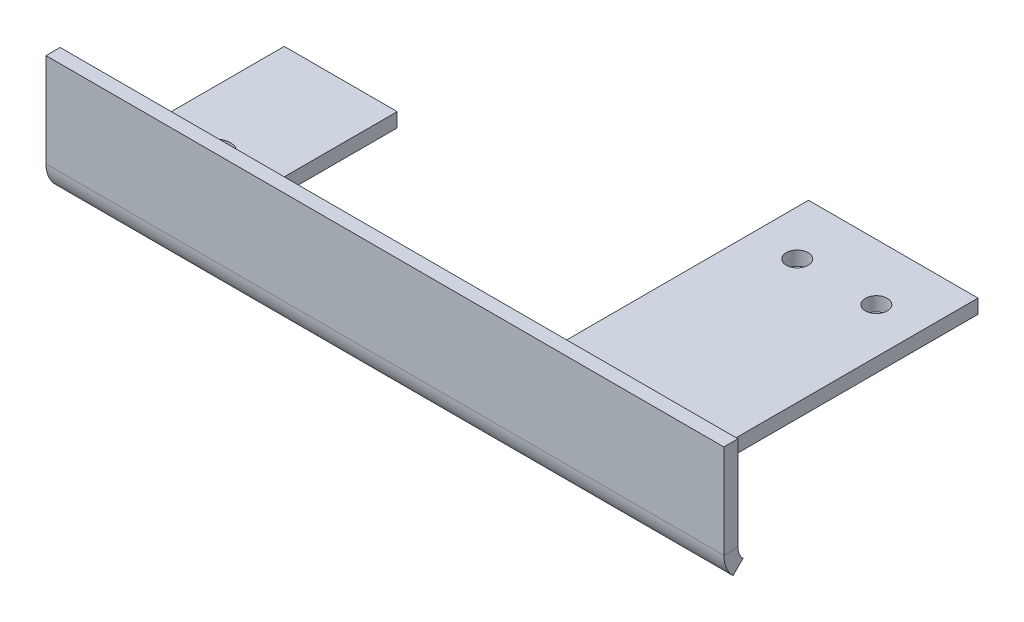
ISO-10303-21;
HEADER;
FILE_DESCRIPTION(('STEP AP214'),'2;1');
FILE_NAME('part.step','',(''),(''),'','','');
FILE_SCHEMA(('AUTOMOTIVE_DESIGN { 1 0 10303 214 1 1 1 1 }'));
ENDSEC;
DATA;
#1=APPLICATION_CONTEXT('core data for automotive mechanical design processes');
#2=APPLICATION_PROTOCOL_DEFINITION('international standard','automotive_design',2000,#1);
#3=PRODUCT_CONTEXT('',#1,'mechanical');
#4=PRODUCT('Part','Part','',(#3));
#5=PRODUCT_RELATED_PRODUCT_CATEGORY('part','',(#4));
#6=PRODUCT_DEFINITION_FORMATION('','',#4);
#7=PRODUCT_DEFINITION_CONTEXT('part definition',#1,'design');
#8=PRODUCT_DEFINITION('design','',#6,#7);
#9=PRODUCT_DEFINITION_SHAPE('','',#8);
#10=(LENGTH_UNIT() NAMED_UNIT(*) SI_UNIT(.MILLI.,.METRE.));
#11=(NAMED_UNIT(*) PLANE_ANGLE_UNIT() SI_UNIT($,.RADIAN.));
#12=(NAMED_UNIT(*) SI_UNIT($,.STERADIAN.) SOLID_ANGLE_UNIT());
#13=UNCERTAINTY_MEASURE_WITH_UNIT(LENGTH_MEASURE(1.E-05),#10,'distance_accuracy_value','');
#14=(GEOMETRIC_REPRESENTATION_CONTEXT(3) GLOBAL_UNCERTAINTY_ASSIGNED_CONTEXT((#13)) GLOBAL_UNIT_ASSIGNED_CONTEXT((#10,
#11,#12)) REPRESENTATION_CONTEXT('',''));
#15=CARTESIAN_POINT('',(0.,0.,0.));
#16=DIRECTION('',(0.,0.,1.));
#17=DIRECTION('',(1.,0.,0.));
#18=AXIS2_PLACEMENT_3D('',#15,#16,#17);
#19=CARTESIAN_POINT('',(127.,1.58750000000002,-5.53197197140583));
#20=DIRECTION('',(1.,0.,0.));
#21=DIRECTION('',(0.,0.,1.));
#22=AXIS2_PLACEMENT_3D('',#19,#20,#21);
#23=PLANE('',#22);
#24=DIRECTION('',(0.,0.,-1.));
#25=VECTOR('',#24,1.);
#26=CARTESIAN_POINT('',(127.,-1.58749999999998,-5.53197197140585));
#27=LINE('',#26,#25);
#28=CARTESIAN_POINT('',(127.,-1.58749999999942,-85.3133719714059));
#29=VERTEX_POINT('',#28);
#30=CARTESIAN_POINT('',(127.,-1.58749999999995,-9.84498598570294));
#31=VERTEX_POINT('',#30);
#32=EDGE_CURVE('E266',#29,#31,#27,.F.);
#33=ORIENTED_EDGE('',*,*,#32,.F.);
#34=DIRECTION('',(0.,1.,0.));
#35=VECTOR('',#34,1.);
#36=CARTESIAN_POINT('',(127.,1.58750000000058,-85.3133719714058));
#37=LINE('',#36,#35);
#38=CARTESIAN_POINT('',(127.,1.58750000000058,-85.3133719714058));
#39=VERTEX_POINT('',#38);
#40=EDGE_CURVE('E267',#29,#39,#37,.T.);
#41=ORIENTED_EDGE('',*,*,#40,.T.);
#42=DIRECTION('',(0.,0.,1.));
#43=VECTOR('',#42,1.);
#44=CARTESIAN_POINT('',(127.,1.58750000000002,-5.53197197140583));
#45=LINE('',#44,#43);
#46=CARTESIAN_POINT('',(127.,1.58750000000005,-9.84498598570292));
#47=VERTEX_POINT('',#46);
#48=EDGE_CURVE('E264',#39,#47,#45,.T.);
#49=ORIENTED_EDGE('',*,*,#48,.T.);
#50=DIRECTION('',(0.,1.,0.));
#51=VECTOR('',#50,1.);
#52=CARTESIAN_POINT('',(127.,1.58750000000005,-9.84498598570292));
#53=LINE('',#52,#51);
#54=EDGE_CURVE('E210',#31,#47,#53,.T.);
#55=ORIENTED_EDGE('',*,*,#54,.F.);
#56=EDGE_LOOP('',(#33,#41,#49,#55));
#57=FACE_BOUND('',#56,.T.);
#58=ADVANCED_FACE('F43',(#57),#23,.T.);
#59=CARTESIAN_POINT('',(88.9,1.58750000000002,-5.53197197140583));
#60=DIRECTION('',(-1.,0.,0.));
#61=DIRECTION('',(0.,0.,-1.));
#62=AXIS2_PLACEMENT_3D('',#59,#60,#61);
#63=PLANE('',#62);
#64=DIRECTION('',(0.,0.,-1.));
#65=VECTOR('',#64,1.);
#66=CARTESIAN_POINT('',(88.9,1.58750000000002,-5.53197197140583));
#67=LINE('',#66,#65);
#68=CARTESIAN_POINT('',(88.9,1.58750000000005,-9.84498598570292));
#69=VERTEX_POINT('',#68);
#70=CARTESIAN_POINT('',(88.9,1.58750000000058,-85.3133719714058));
#71=VERTEX_POINT('',#70);
#72=EDGE_CURVE('E47',#69,#71,#67,.T.);
#73=ORIENTED_EDGE('',*,*,#72,.T.);
#74=DIRECTION('',(0.,1.,0.));
#75=VECTOR('',#74,1.);
#76=CARTESIAN_POINT('',(88.9,1.58750000000058,-85.3133719714058));
#77=LINE('',#76,#75);
#78=CARTESIAN_POINT('',(88.9,-1.58749999999942,-85.3133719714059));
#79=VERTEX_POINT('',#78);
#80=EDGE_CURVE('E270',#79,#71,#77,.T.);
#81=ORIENTED_EDGE('',*,*,#80,.F.);
#82=DIRECTION('',(0.,0.,-1.));
#83=VECTOR('',#82,1.);
#84=CARTESIAN_POINT('',(88.9,-1.58749999999998,-5.53197197140585));
#85=LINE('',#84,#83);
#86=CARTESIAN_POINT('',(88.9,-1.58749999999995,-9.84498598570294));
#87=VERTEX_POINT('',#86);
#88=EDGE_CURVE('E236',#87,#79,#85,.T.);
#89=ORIENTED_EDGE('',*,*,#88,.F.);
#90=DIRECTION('',(0.,-1.,0.));
#91=VECTOR('',#90,1.);
#92=CARTESIAN_POINT('',(88.9,1.58750000000005,-9.84498598570292));
#93=LINE('',#92,#91);
#94=EDGE_CURVE('E11',#69,#87,#93,.T.);
#95=ORIENTED_EDGE('',*,*,#94,.F.);
#96=EDGE_LOOP('',(#73,#81,#89,#95));
#97=FACE_BOUND('',#96,.T.);
#98=ADVANCED_FACE('F288',(#97),#63,.T.);
#99=CARTESIAN_POINT('',(0.,1.58750000000002,-5.53197197140583));
#100=DIRECTION('',(0.,1.,0.));
#101=DIRECTION('',(0.,0.,-1.));
#102=AXIS2_PLACEMENT_3D('',#99,#100,#101);
#103=PLANE('',#102);
#104=CARTESIAN_POINT('',(116.84,1.58750000000049,-72.6133719714058));
#105=DIRECTION('',(0.,-1.,0.));
#106=DIRECTION('',(0.,0.,-1.));
#107=AXIS2_PLACEMENT_3D('',#104,#105,#106);
#108=CIRCLE('',#107,2.4638);
#109=CARTESIAN_POINT('',(116.84,1.5875000000005,-75.0771719714058));
#110=VERTEX_POINT('',#109);
#111=EDGE_CURVE('E319',#110,#110,#108,.T.);
#112=ORIENTED_EDGE('',*,*,#111,.T.);
#113=EDGE_LOOP('',(#112));
#114=FACE_BOUND('',#113,.T.);
#115=CARTESIAN_POINT('',(99.06,1.58750000000049,-72.6133719714058));
#116=DIRECTION('',(0.,-1.,0.));
#117=DIRECTION('',(0.,0.,-1.));
#118=AXIS2_PLACEMENT_3D('',#115,#116,#117);
#119=CIRCLE('',#118,2.4638);
#120=CARTESIAN_POINT('',(99.06,1.5875000000005,-75.0771719714058));
#121=VERTEX_POINT('',#120);
#122=EDGE_CURVE('E322',#121,#121,#119,.T.);
#123=ORIENTED_EDGE('',*,*,#122,.T.);
#124=EDGE_LOOP('',(#123));
#125=FACE_BOUND('',#124,.T.);
#126=ORIENTED_EDGE('',*,*,#48,.F.);
#127=DIRECTION('',(1.,0.,0.));
#128=VECTOR('',#127,1.);
#129=CARTESIAN_POINT('',(88.9,1.58750000000058,-85.3133719714058));
#130=LINE('',#129,#128);
#131=EDGE_CURVE('E68',#71,#39,#130,.T.);
#132=ORIENTED_EDGE('',*,*,#131,.F.);
#133=ORIENTED_EDGE('',*,*,#72,.F.);
#134=DIRECTION('',(-1.,0.,0.));
#135=VECTOR('',#134,1.);
#136=CARTESIAN_POINT('',(0.,1.58750000000005,-9.84498598570292));
#137=LINE('',#136,#135);
#138=EDGE_CURVE('E272',#47,#69,#137,.T.);
#139=ORIENTED_EDGE('',*,*,#138,.F.);
#140=EDGE_LOOP('',(#126,#132,#133,#139));
#141=FACE_BOUND('',#140,.T.);
#142=ADVANCED_FACE('F282',(#114,#125,#141),#103,.T.);
#143=CARTESIAN_POINT('',(88.9,1.58750000000058,-85.3133719714058));
#144=DIRECTION('',(0.,0.,-1.));
#145=DIRECTION('',(1.,0.,0.));
#146=AXIS2_PLACEMENT_3D('',#143,#144,#145);
#147=PLANE('',#146);
#148=ORIENTED_EDGE('',*,*,#80,.T.);
#149=ORIENTED_EDGE('',*,*,#131,.T.);
#150=ORIENTED_EDGE('',*,*,#40,.F.);
#151=DIRECTION('',(1.,0.,0.));
#152=VECTOR('',#151,1.);
#153=CARTESIAN_POINT('',(0.,-1.58749999999942,-85.3133719714059));
#154=LINE('',#153,#152);
#155=EDGE_CURVE('E78',#79,#29,#154,.T.);
#156=ORIENTED_EDGE('',*,*,#155,.F.);
#157=EDGE_LOOP('',(#148,#149,#150,#156));
#158=FACE_BOUND('',#157,.T.);
#159=ADVANCED_FACE('F309',(#158),#147,.T.);
#160=CARTESIAN_POINT('',(0.,-1.58749999999998,-5.53197197140585));
#161=DIRECTION('',(0.,1.,0.));
#162=DIRECTION('',(0.,0.,-1.));
#163=AXIS2_PLACEMENT_3D('',#160,#161,#162);
#164=PLANE('',#163);
#165=CARTESIAN_POINT('',(116.84,-1.58749999999951,-72.6133719714059));
#166=DIRECTION('',(0.,-1.,0.));
#167=DIRECTION('',(0.,0.,-1.));
#168=AXIS2_PLACEMENT_3D('',#165,#166,#167);
#169=CIRCLE('',#168,2.4638);
#170=CARTESIAN_POINT('',(116.84,-1.5874999999995,-75.0771719714059));
#171=VERTEX_POINT('',#170);
#172=EDGE_CURVE('E325',#171,#171,#169,.T.);
#173=ORIENTED_EDGE('',*,*,#172,.F.);
#174=EDGE_LOOP('',(#173));
#175=FACE_BOUND('',#174,.T.);
#176=CARTESIAN_POINT('',(99.06,-1.58749999999951,-72.6133719714059));
#177=DIRECTION('',(0.,-1.,0.));
#178=DIRECTION('',(0.,0.,-1.));
#179=AXIS2_PLACEMENT_3D('',#176,#177,#178);
#180=CIRCLE('',#179,2.4638);
#181=CARTESIAN_POINT('',(99.06,-1.5874999999995,-75.0771719714059));
#182=VERTEX_POINT('',#181);
#183=EDGE_CURVE('E324',#182,#182,#180,.T.);
#184=ORIENTED_EDGE('',*,*,#183,.F.);
#185=EDGE_LOOP('',(#184));
#186=FACE_BOUND('',#185,.T.);
#187=DIRECTION('',(-1.,0.,0.));
#188=VECTOR('',#187,1.);
#189=CARTESIAN_POINT('',(0.,-1.58749999999995,-9.84498598570295));
#190=LINE('',#189,#188);
#191=EDGE_CURVE('E52',#31,#87,#190,.T.);
#192=ORIENTED_EDGE('',*,*,#191,.T.);
#193=ORIENTED_EDGE('',*,*,#88,.T.);
#194=ORIENTED_EDGE('',*,*,#155,.T.);
#195=ORIENTED_EDGE('',*,*,#32,.T.);
#196=EDGE_LOOP('',(#192,#193,#194,#195));
#197=FACE_BOUND('',#196,.T.);
#198=ADVANCED_FACE('F45',(#175,#186,#197),#164,.F.);
#199=CARTESIAN_POINT('',(127.,26.5784859857029,-5.94098598570283));
#200=DIRECTION('',(0.,1.,0.));
#201=DIRECTION('',(-1.,0.,0.));
#202=AXIS2_PLACEMENT_3D('',#199,#200,#201);
#203=PLANE('',#202);
#204=DIRECTION('',(0.,0.,-1.));
#205=VECTOR('',#204,1.);
#206=CARTESIAN_POINT('',(152.4,26.5784859857029,-5.94098598570283));
#207=LINE('',#206,#205);
#208=CARTESIAN_POINT('',(152.4,26.5784859857029,-2.76598598570283));
#209=VERTEX_POINT('',#208);
#210=CARTESIAN_POINT('',(152.4,26.5784859857029,-5.94098598570283));
#211=VERTEX_POINT('',#210);
#212=EDGE_CURVE('E240',#209,#211,#207,.T.);
#213=ORIENTED_EDGE('',*,*,#212,.T.);
#214=DIRECTION('',(-1.,0.,0.));
#215=VECTOR('',#214,1.);
#216=CARTESIAN_POINT('',(127.,26.5784859857029,-5.94098598570283));
#217=LINE('',#216,#215);
#218=CARTESIAN_POINT('',(0.,26.5784859857029,-5.94098598570283));
#219=VERTEX_POINT('',#218);
#220=EDGE_CURVE('E248',#211,#219,#217,.T.);
#221=ORIENTED_EDGE('',*,*,#220,.T.);
#222=DIRECTION('',(0.,0.,-1.));
#223=VECTOR('',#222,1.);
#224=CARTESIAN_POINT('',(0.,26.5784859857029,-5.94098598570283));
#225=LINE('',#224,#223);
#226=CARTESIAN_POINT('',(0.,26.5784859857029,-2.76598598570283));
#227=VERTEX_POINT('',#226);
#228=EDGE_CURVE('E253',#227,#219,#225,.T.);
#229=ORIENTED_EDGE('',*,*,#228,.F.);
#230=DIRECTION('',(1.,0.,0.));
#231=VECTOR('',#230,1.);
#232=CARTESIAN_POINT('',(0.,26.5784859857029,-2.76598598570283));
#233=LINE('',#232,#231);
#234=EDGE_CURVE('E255',#209,#227,#233,.F.);
#235=ORIENTED_EDGE('',*,*,#234,.F.);
#236=EDGE_LOOP('',(#213,#221,#229,#235));
#237=FACE_BOUND('',#236,.T.);
#238=ADVANCED_FACE('F399',(#237),#203,.T.);
#239=CARTESIAN_POINT('',(0.,1.17848598570294,-5.94098598570292));
#240=DIRECTION('',(0.,0.,-1.));
#241=DIRECTION('',(0.,-1.,0.));
#242=AXIS2_PLACEMENT_3D('',#239,#240,#241);
#243=PLANE('',#242);
#244=DIRECTION('',(-1.,0.,0.));
#245=VECTOR('',#244,1.);
#246=CARTESIAN_POINT('',(0.,5.49150000000003,-5.9409859857029));
#247=LINE('',#246,#245);
#248=CARTESIAN_POINT('',(152.4,5.49150000000002,-5.9409859857029));
#249=VERTEX_POINT('',#248);
#250=CARTESIAN_POINT('',(0.,5.49150000000003,-5.9409859857029));
#251=VERTEX_POINT('',#250);
#252=EDGE_CURVE('E234',#249,#251,#247,.T.);
#253=ORIENTED_EDGE('',*,*,#252,.T.);
#254=DIRECTION('',(0.,-1.,0.));
#255=VECTOR('',#254,1.);
#256=CARTESIAN_POINT('',(0.,1.17848598570294,-5.94098598570292));
#257=LINE('',#256,#255);
#258=EDGE_CURVE('E245',#219,#251,#257,.T.);
#259=ORIENTED_EDGE('',*,*,#258,.F.);
#260=ORIENTED_EDGE('',*,*,#220,.F.);
#261=DIRECTION('',(0.,1.,0.));
#262=VECTOR('',#261,1.);
#263=CARTESIAN_POINT('',(152.4,26.5784859857029,-5.94098598570283));
#264=LINE('',#263,#262);
#265=EDGE_CURVE('E251',#249,#211,#264,.T.);
#266=ORIENTED_EDGE('',*,*,#265,.F.);
#267=EDGE_LOOP('',(#253,#259,#260,#266));
#268=FACE_BOUND('',#267,.T.);
#269=ADVANCED_FACE('F387',(#268),#243,.T.);
#270=CARTESIAN_POINT('',(152.4,26.5784859857029,-5.94098598570283));
#271=DIRECTION('',(1.,0.,0.));
#272=DIRECTION('',(0.,1.,0.));
#273=AXIS2_PLACEMENT_3D('',#270,#271,#272);
#274=PLANE('',#273);
#275=DIRECTION('',(0.,0.,-1.));
#276=VECTOR('',#275,1.);
#277=CARTESIAN_POINT('',(152.4,5.49150000000003,-5.9409859857029));
#278=LINE('',#277,#276);
#279=CARTESIAN_POINT('',(152.4,5.49150000000002,-2.7659859857029));
#280=VERTEX_POINT('',#279);
#281=EDGE_CURVE('E257',#280,#249,#278,.T.);
#282=ORIENTED_EDGE('',*,*,#281,.T.);
#283=ORIENTED_EDGE('',*,*,#265,.T.);
#284=ORIENTED_EDGE('',*,*,#212,.F.);
#285=DIRECTION('',(0.,-1.,0.));
#286=VECTOR('',#285,1.);
#287=CARTESIAN_POINT('',(152.4,1.17848598570293,-2.76598598570292));
#288=LINE('',#287,#286);
#289=EDGE_CURVE('E243',#280,#209,#288,.F.);
#290=ORIENTED_EDGE('',*,*,#289,.F.);
#291=EDGE_LOOP('',(#282,#283,#284,#290));
#292=FACE_BOUND('',#291,.T.);
#293=ADVANCED_FACE('F390',(#292),#274,.T.);
#294=CARTESIAN_POINT('',(0.,1.17848598570293,-2.76598598570292));
#295=DIRECTION('',(0.,0.,-1.));
#296=DIRECTION('',(0.,-1.,0.));
#297=AXIS2_PLACEMENT_3D('',#294,#295,#296);
#298=PLANE('',#297);
#299=ORIENTED_EDGE('',*,*,#289,.T.);
#300=ORIENTED_EDGE('',*,*,#234,.T.);
#301=DIRECTION('',(0.,-1.,0.));
#302=VECTOR('',#301,1.);
#303=CARTESIAN_POINT('',(0.,1.17848598570293,-2.76598598570292));
#304=LINE('',#303,#302);
#305=CARTESIAN_POINT('',(0.,5.49150000000002,-2.7659859857029));
#306=VERTEX_POINT('',#305);
#307=EDGE_CURVE('E87',#227,#306,#304,.T.);
#308=ORIENTED_EDGE('',*,*,#307,.T.);
#309=DIRECTION('',(-1.,0.,0.));
#310=VECTOR('',#309,1.);
#311=CARTESIAN_POINT('',(0.,5.49150000000002,-2.7659859857029));
#312=LINE('',#311,#310);
#313=EDGE_CURVE('E237',#280,#306,#312,.T.);
#314=ORIENTED_EDGE('',*,*,#313,.F.);
#315=EDGE_LOOP('',(#299,#300,#308,#314));
#316=FACE_BOUND('',#315,.T.);
#317=ADVANCED_FACE('F585',(#316),#298,.F.);
#318=CARTESIAN_POINT('',(0.,1.17848598570294,-5.94098598570292));
#319=DIRECTION('',(-1.,0.,0.));
#320=DIRECTION('',(0.,-1.,0.));
#321=AXIS2_PLACEMENT_3D('',#318,#319,#320);
#322=PLANE('',#321);
#323=DIRECTION('',(0.,0.,1.));
#324=VECTOR('',#323,1.);
#325=CARTESIAN_POINT('',(0.,5.49150000000003,-5.9409859857029));
#326=LINE('',#325,#324);
#327=EDGE_CURVE('E259',#251,#306,#326,.T.);
#328=ORIENTED_EDGE('',*,*,#327,.T.);
#329=ORIENTED_EDGE('',*,*,#307,.F.);
#330=ORIENTED_EDGE('',*,*,#228,.T.);
#331=ORIENTED_EDGE('',*,*,#258,.T.);
#332=EDGE_LOOP('',(#328,#329,#330,#331));
#333=FACE_BOUND('',#332,.T.);
#334=ADVANCED_FACE('F382',(#333),#322,.T.);
#335=CARTESIAN_POINT('',(0.,5.49150000000005,-9.8449859857029));
#336=DIRECTION('',(1.,0.,0.));
#337=DIRECTION('',(0.,0.,1.));
#338=AXIS2_PLACEMENT_3D('',#335,#336,#337);
#339=PLANE('',#338);
#340=ORIENTED_EDGE('',*,*,#327,.F.);
#341=CARTESIAN_POINT('',(0.,5.49150000000005,-9.8449859857029));
#342=DIRECTION('',(1.,0.,0.));
#343=DIRECTION('',(0.,0.,-1.));
#344=AXIS2_PLACEMENT_3D('',#341,#342,#343);
#345=CIRCLE('',#344,3.904);
#346=CARTESIAN_POINT('',(0.,1.58750000000005,-9.84498598570292));
#347=VERTEX_POINT('',#346);
#348=EDGE_CURVE('E113',#251,#347,#345,.T.);
#349=ORIENTED_EDGE('',*,*,#348,.T.);
#350=DIRECTION('',(0.,1.,0.));
#351=VECTOR('',#350,1.);
#352=CARTESIAN_POINT('',(0.,1.58750000000005,-9.84498598570292));
#353=LINE('',#352,#351);
#354=CARTESIAN_POINT('',(0.,-1.58749999999995,-9.84498598570295));
#355=VERTEX_POINT('',#354);
#356=EDGE_CURVE('E355',#355,#347,#353,.T.);
#357=ORIENTED_EDGE('',*,*,#356,.F.);
#358=CARTESIAN_POINT('',(0.,5.49150000000005,-9.8449859857029));
#359=DIRECTION('',(1.,0.,0.));
#360=DIRECTION('',(0.,0.,-1.));
#361=AXIS2_PLACEMENT_3D('',#358,#359,#360);
#362=CIRCLE('',#361,7.079);
#363=EDGE_CURVE('E227',#306,#355,#362,.T.);
#364=ORIENTED_EDGE('',*,*,#363,.F.);
#365=EDGE_LOOP('',(#340,#349,#357,#364));
#366=FACE_BOUND('',#365,.T.);
#367=ADVANCED_FACE('F381',(#366),#339,.F.);
#368=CARTESIAN_POINT('',(25.4,5.49150000000005,-9.8449859857029));
#369=DIRECTION('',(-1.,0.,0.));
#370=DIRECTION('',(0.,0.,-1.));
#371=AXIS2_PLACEMENT_3D('',#368,#369,#370);
#372=PLANE('',#371);
#373=DIRECTION('',(0.,-1.,0.));
#374=VECTOR('',#373,1.);
#375=CARTESIAN_POINT('',(25.4,1.58750000000005,-9.84498598570292));
#376=LINE('',#375,#374);
#377=CARTESIAN_POINT('',(25.4,1.58750000000005,-9.84498598570292));
#378=VERTEX_POINT('',#377);
#379=CARTESIAN_POINT('',(25.4,-1.58749999999995,-9.84498598570295));
#380=VERTEX_POINT('',#379);
#381=EDGE_CURVE('E358',#378,#380,#376,.T.);
#382=ORIENTED_EDGE('',*,*,#381,.F.);
#383=CARTESIAN_POINT('',(25.4,5.49150000000005,-9.8449859857029));
#384=DIRECTION('',(-1.,0.,0.));
#385=DIRECTION('',(0.,0.,1.));
#386=AXIS2_PLACEMENT_3D('',#383,#384,#385);
#387=CIRCLE('',#386,3.904);
#388=CARTESIAN_POINT('',(25.4,2.73095512624775,-7.08444111195063));
#389=VERTEX_POINT('',#388);
#390=EDGE_CURVE('E363',#378,#389,#387,.T.);
#391=ORIENTED_EDGE('',*,*,#390,.T.);
#392=DIRECTION('',(0.,0.707106781186551,-0.707106781186544));
#393=VECTOR('',#392,1.);
#394=CARTESIAN_POINT('',(25.4,2.73095512624775,-7.08444111195063));
#395=LINE('',#394,#393);
#396=CARTESIAN_POINT('',(25.4,0.485891095980454,-4.83937708168335));
#397=VERTEX_POINT('',#396);
#398=EDGE_CURVE('E232',#397,#389,#395,.T.);
#399=ORIENTED_EDGE('',*,*,#398,.F.);
#400=CARTESIAN_POINT('',(25.4,5.49150000000005,-9.8449859857029));
#401=DIRECTION('',(1.,0.,0.));
#402=DIRECTION('',(0.,0.,-1.));
#403=AXIS2_PLACEMENT_3D('',#400,#401,#402);
#404=CIRCLE('',#403,7.079);
#405=EDGE_CURVE('E225',#380,#397,#404,.F.);
#406=ORIENTED_EDGE('',*,*,#405,.F.);
#407=EDGE_LOOP('',(#382,#391,#399,#406));
#408=FACE_BOUND('',#407,.T.);
#409=ADVANCED_FACE('F300',(#408),#372,.F.);
#410=CARTESIAN_POINT('',(57.15,2.73095512624775,-7.08444111195063));
#411=DIRECTION('',(0.,0.707106781186544,0.707106781186551));
#412=DIRECTION('',(1.,0.,0.));
#413=AXIS2_PLACEMENT_3D('',#410,#411,#412);
#414=PLANE('',#413);
#415=ORIENTED_EDGE('',*,*,#398,.T.);
#416=DIRECTION('',(1.,0.,0.));
#417=VECTOR('',#416,1.);
#418=CARTESIAN_POINT('',(25.4,2.73095512624775,-7.08444111195063));
#419=LINE('',#418,#417);
#420=CARTESIAN_POINT('',(88.9,2.73095512624775,-7.08444111195063));
#421=VERTEX_POINT('',#420);
#422=EDGE_CURVE('E213',#389,#421,#419,.T.);
#423=ORIENTED_EDGE('',*,*,#422,.T.);
#424=DIRECTION('',(0.,0.707106781186551,-0.707106781186544));
#425=VECTOR('',#424,1.);
#426=CARTESIAN_POINT('',(88.9,2.73095512624775,-7.08444111195063));
#427=LINE('',#426,#425);
#428=CARTESIAN_POINT('',(88.9,0.485891095980454,-4.83937708168335));
#429=VERTEX_POINT('',#428);
#430=EDGE_CURVE('E204',#429,#421,#427,.T.);
#431=ORIENTED_EDGE('',*,*,#430,.F.);
#432=DIRECTION('',(-1.,0.,0.));
#433=VECTOR('',#432,1.);
#434=CARTESIAN_POINT('',(165.376943198867,0.485891095980454,-4.83937708168335));
#435=LINE('',#434,#433);
#436=EDGE_CURVE('E149',#397,#429,#435,.F.);
#437=ORIENTED_EDGE('',*,*,#436,.F.);
#438=EDGE_LOOP('',(#415,#423,#431,#437));
#439=FACE_BOUND('',#438,.T.);
#440=ADVANCED_FACE('F293',(#439),#414,.F.);
#441=CARTESIAN_POINT('',(88.9,5.49150000000005,-9.8449859857029));
#442=DIRECTION('',(1.,0.,0.));
#443=DIRECTION('',(0.,0.,1.));
#444=AXIS2_PLACEMENT_3D('',#441,#442,#443);
#445=PLANE('',#444);
#446=ORIENTED_EDGE('',*,*,#430,.T.);
#447=CARTESIAN_POINT('',(88.9,5.49150000000005,-9.8449859857029));
#448=DIRECTION('',(1.,0.,0.));
#449=DIRECTION('',(0.,0.,-1.));
#450=AXIS2_PLACEMENT_3D('',#447,#448,#449);
#451=CIRCLE('',#450,3.904);
#452=EDGE_CURVE('E59',#421,#69,#451,.T.);
#453=ORIENTED_EDGE('',*,*,#452,.T.);
#454=ORIENTED_EDGE('',*,*,#94,.T.);
#455=CARTESIAN_POINT('',(88.9,5.49150000000005,-9.8449859857029));
#456=DIRECTION('',(1.,0.,0.));
#457=DIRECTION('',(0.,0.,-1.));
#458=AXIS2_PLACEMENT_3D('',#455,#456,#457);
#459=CIRCLE('',#458,7.079);
#460=EDGE_CURVE('E142',#429,#87,#459,.T.);
#461=ORIENTED_EDGE('',*,*,#460,.F.);
#462=EDGE_LOOP('',(#446,#453,#454,#461));
#463=FACE_BOUND('',#462,.T.);
#464=ADVANCED_FACE('F290',(#463),#445,.F.);
#465=CARTESIAN_POINT('',(127.,5.49150000000005,-9.8449859857029));
#466=DIRECTION('',(-1.,0.,0.));
#467=DIRECTION('',(0.,0.,-1.));
#468=AXIS2_PLACEMENT_3D('',#465,#466,#467);
#469=PLANE('',#468);
#470=ORIENTED_EDGE('',*,*,#54,.T.);
#471=CARTESIAN_POINT('',(127.,5.49150000000005,-9.8449859857029));
#472=DIRECTION('',(-1.,0.,0.));
#473=DIRECTION('',(0.,0.,1.));
#474=AXIS2_PLACEMENT_3D('',#471,#472,#473);
#475=CIRCLE('',#474,3.904);
#476=CARTESIAN_POINT('',(127.,2.73095512624775,-7.08444111195063));
#477=VERTEX_POINT('',#476);
#478=EDGE_CURVE('E192',#47,#477,#475,.T.);
#479=ORIENTED_EDGE('',*,*,#478,.T.);
#480=DIRECTION('',(0.,0.707106781186551,-0.707106781186544));
#481=VECTOR('',#480,1.);
#482=CARTESIAN_POINT('',(127.,2.73095512624775,-7.08444111195063));
#483=LINE('',#482,#481);
#484=CARTESIAN_POINT('',(127.,0.485891095980454,-4.83937708168335));
#485=VERTEX_POINT('',#484);
#486=EDGE_CURVE('E198',#485,#477,#483,.T.);
#487=ORIENTED_EDGE('',*,*,#486,.F.);
#488=CARTESIAN_POINT('',(127.,5.49150000000005,-9.8449859857029));
#489=DIRECTION('',(1.,0.,0.));
#490=DIRECTION('',(0.,0.,-1.));
#491=AXIS2_PLACEMENT_3D('',#488,#489,#490);
#492=CIRCLE('',#491,7.079);
#493=EDGE_CURVE('E221',#31,#485,#492,.F.);
#494=ORIENTED_EDGE('',*,*,#493,.F.);
#495=EDGE_LOOP('',(#470,#479,#487,#494));
#496=FACE_BOUND('',#495,.T.);
#497=ADVANCED_FACE('F208',(#496),#469,.F.);
#498=CARTESIAN_POINT('',(139.7,2.73095512624775,-7.08444111195063));
#499=DIRECTION('',(0.,0.707106781186544,0.707106781186551));
#500=DIRECTION('',(1.,0.,0.));
#501=AXIS2_PLACEMENT_3D('',#498,#499,#500);
#502=PLANE('',#501);
#503=ORIENTED_EDGE('',*,*,#486,.T.);
#504=DIRECTION('',(1.,0.,0.));
#505=VECTOR('',#504,1.);
#506=CARTESIAN_POINT('',(127.,2.73095512624775,-7.08444111195063));
#507=LINE('',#506,#505);
#508=CARTESIAN_POINT('',(152.4,2.73095512624775,-7.08444111195063));
#509=VERTEX_POINT('',#508);
#510=EDGE_CURVE('E188',#477,#509,#507,.T.);
#511=ORIENTED_EDGE('',*,*,#510,.T.);
#512=DIRECTION('',(0.,0.707106781186551,-0.707106781186544));
#513=VECTOR('',#512,1.);
#514=CARTESIAN_POINT('',(152.4,2.73095512624775,-7.08444111195063));
#515=LINE('',#514,#513);
#516=CARTESIAN_POINT('',(152.4,0.485891095980454,-4.83937708168335));
#517=VERTEX_POINT('',#516);
#518=EDGE_CURVE('E205',#517,#509,#515,.T.);
#519=ORIENTED_EDGE('',*,*,#518,.F.);
#520=DIRECTION('',(-1.,0.,0.));
#521=VECTOR('',#520,1.);
#522=CARTESIAN_POINT('',(165.376943198867,0.485891095980454,-4.83937708168335));
#523=LINE('',#522,#521);
#524=EDGE_CURVE('E201',#485,#517,#523,.F.);
#525=ORIENTED_EDGE('',*,*,#524,.F.);
#526=EDGE_LOOP('',(#503,#511,#519,#525));
#527=FACE_BOUND('',#526,.T.);
#528=ADVANCED_FACE('F199',(#527),#502,.F.);
#529=CARTESIAN_POINT('',(152.4,5.49150000000005,-9.8449859857029));
#530=DIRECTION('',(-1.,0.,0.));
#531=DIRECTION('',(0.,0.,-1.));
#532=AXIS2_PLACEMENT_3D('',#529,#530,#531);
#533=PLANE('',#532);
#534=ORIENTED_EDGE('',*,*,#518,.T.);
#535=CARTESIAN_POINT('',(152.4,5.49150000000005,-9.8449859857029));
#536=DIRECTION('',(-1.,0.,0.));
#537=DIRECTION('',(0.,0.,1.));
#538=AXIS2_PLACEMENT_3D('',#535,#536,#537);
#539=CIRCLE('',#538,3.904);
#540=EDGE_CURVE('E122',#509,#249,#539,.T.);
#541=ORIENTED_EDGE('',*,*,#540,.T.);
#542=ORIENTED_EDGE('',*,*,#281,.F.);
#543=CARTESIAN_POINT('',(152.4,5.49150000000005,-9.8449859857029));
#544=DIRECTION('',(1.,0.,0.));
#545=DIRECTION('',(0.,0.,-1.));
#546=AXIS2_PLACEMENT_3D('',#543,#544,#545);
#547=CIRCLE('',#546,7.079);
#548=EDGE_CURVE('E218',#517,#280,#547,.F.);
#549=ORIENTED_EDGE('',*,*,#548,.F.);
#550=EDGE_LOOP('',(#534,#541,#542,#549));
#551=FACE_BOUND('',#550,.T.);
#552=ADVANCED_FACE('F392',(#551),#533,.F.);
#553=CARTESIAN_POINT('',(165.376943198867,5.49150000000005,-9.8449859857029));
#554=DIRECTION('',(-1.,0.,0.));
#555=DIRECTION('',(0.,0.,-1.));
#556=AXIS2_PLACEMENT_3D('',#553,#554,#555);
#557=CYLINDRICAL_SURFACE('',#556,3.904);
#558=ORIENTED_EDGE('',*,*,#540,.F.);
#559=ORIENTED_EDGE('',*,*,#510,.F.);
#560=ORIENTED_EDGE('',*,*,#478,.F.);
#561=ORIENTED_EDGE('',*,*,#138,.T.);
#562=ORIENTED_EDGE('',*,*,#452,.F.);
#563=ORIENTED_EDGE('',*,*,#422,.F.);
#564=ORIENTED_EDGE('',*,*,#390,.F.);
#565=DIRECTION('',(1.,0.,0.));
#566=VECTOR('',#565,1.);
#567=CARTESIAN_POINT('',(0.,1.58750000000005,-9.84498598570292));
#568=LINE('',#567,#566);
#569=EDGE_CURVE('E328',#347,#378,#568,.T.);
#570=ORIENTED_EDGE('',*,*,#569,.F.);
#571=ORIENTED_EDGE('',*,*,#348,.F.);
#572=ORIENTED_EDGE('',*,*,#252,.F.);
#573=EDGE_LOOP('',(#558,#559,#560,#561,#562,#563,#564,#570,#571,#572));
#574=FACE_BOUND('',#573,.T.);
#575=ADVANCED_FACE('F190',(#574),#557,.F.);
#576=CARTESIAN_POINT('',(165.376943198867,5.49150000000005,-9.8449859857029));
#577=DIRECTION('',(-1.,0.,0.));
#578=DIRECTION('',(0.,0.,-1.));
#579=AXIS2_PLACEMENT_3D('',#576,#577,#578);
#580=CYLINDRICAL_SURFACE('',#579,7.079);
#581=ORIENTED_EDGE('',*,*,#548,.T.);
#582=ORIENTED_EDGE('',*,*,#313,.T.);
#583=ORIENTED_EDGE('',*,*,#363,.T.);
#584=DIRECTION('',(1.,0.,0.));
#585=VECTOR('',#584,1.);
#586=CARTESIAN_POINT('',(0.,-1.58749999999995,-9.84498598570295));
#587=LINE('',#586,#585);
#588=EDGE_CURVE('E335',#355,#380,#587,.T.);
#589=ORIENTED_EDGE('',*,*,#588,.T.);
#590=ORIENTED_EDGE('',*,*,#405,.T.);
#591=ORIENTED_EDGE('',*,*,#436,.T.);
#592=ORIENTED_EDGE('',*,*,#460,.T.);
#593=ORIENTED_EDGE('',*,*,#191,.F.);
#594=ORIENTED_EDGE('',*,*,#493,.T.);
#595=ORIENTED_EDGE('',*,*,#524,.T.);
#596=EDGE_LOOP('',(#581,#582,#583,#589,#590,#591,#592,#593,#594,#595));
#597=FACE_BOUND('',#596,.T.);
#598=ADVANCED_FACE('F395',(#597),#580,.T.);
#599=CARTESIAN_POINT('',(0.,1.58750000000037,-56.3319719714058));
#600=DIRECTION('',(0.,0.,-1.));
#601=DIRECTION('',(1.,0.,0.));
#602=AXIS2_PLACEMENT_3D('',#599,#600,#601);
#603=PLANE('',#602);
#604=DIRECTION('',(1.,0.,0.));
#605=VECTOR('',#604,1.);
#606=CARTESIAN_POINT('',(0.,-1.58749999999963,-56.3319719714059));
#607=LINE('',#606,#605);
#608=CARTESIAN_POINT('',(0.,-1.58749999999963,-56.3319719714059));
#609=VERTEX_POINT('',#608);
#610=CARTESIAN_POINT('',(25.4,-1.58749999999963,-56.3319719714059));
#611=VERTEX_POINT('',#610);
#612=EDGE_CURVE('E352',#609,#611,#607,.T.);
#613=ORIENTED_EDGE('',*,*,#612,.F.);
#614=DIRECTION('',(0.,1.,0.));
#615=VECTOR('',#614,1.);
#616=CARTESIAN_POINT('',(0.,1.58750000000037,-56.3319719714058));
#617=LINE('',#616,#615);
#618=CARTESIAN_POINT('',(0.,1.58750000000037,-56.3319719714058));
#619=VERTEX_POINT('',#618);
#620=EDGE_CURVE('E338',#609,#619,#617,.T.);
#621=ORIENTED_EDGE('',*,*,#620,.T.);
#622=DIRECTION('',(1.,0.,0.));
#623=VECTOR('',#622,1.);
#624=CARTESIAN_POINT('',(0.,1.58750000000037,-56.3319719714058));
#625=LINE('',#624,#623);
#626=CARTESIAN_POINT('',(25.4,1.58750000000037,-56.3319719714058));
#627=VERTEX_POINT('',#626);
#628=EDGE_CURVE('E345',#619,#627,#625,.T.);
#629=ORIENTED_EDGE('',*,*,#628,.T.);
#630=DIRECTION('',(0.,1.,0.));
#631=VECTOR('',#630,1.);
#632=CARTESIAN_POINT('',(25.4,1.58750000000037,-56.3319719714058));
#633=LINE('',#632,#631);
#634=EDGE_CURVE('E350',#611,#627,#633,.T.);
#635=ORIENTED_EDGE('',*,*,#634,.F.);
#636=EDGE_LOOP('',(#613,#621,#629,#635));
#637=FACE_BOUND('',#636,.T.);
#638=ADVANCED_FACE('F425',(#637),#603,.T.);
#639=CARTESIAN_POINT('',(0.,1.58750000000002,-5.53197197140583));
#640=DIRECTION('',(0.,1.,0.));
#641=DIRECTION('',(0.,0.,-1.));
#642=AXIS2_PLACEMENT_3D('',#639,#640,#641);
#643=PLANE('',#642);
#644=CARTESIAN_POINT('',(12.7,1.58750000000018,-28.165985985703));
#645=DIRECTION('',(0.,-1.,0.));
#646=DIRECTION('',(0.,0.,-1.));
#647=AXIS2_PLACEMENT_3D('',#644,#645,#646);
#648=CIRCLE('',#647,3.3734375);
#649=CARTESIAN_POINT('',(12.7,1.5875000000002,-31.539423485703));
#650=VERTEX_POINT('',#649);
#651=EDGE_CURVE('E700',#650,#650,#648,.T.);
#652=ORIENTED_EDGE('',*,*,#651,.T.);
#653=EDGE_LOOP('',(#652));
#654=FACE_BOUND('',#653,.T.);
#655=ORIENTED_EDGE('',*,*,#569,.T.);
#656=DIRECTION('',(0.,0.,1.));
#657=VECTOR('',#656,1.);
#658=CARTESIAN_POINT('',(25.4,1.58750000000002,-5.53197197140583));
#659=LINE('',#658,#657);
#660=EDGE_CURVE('E343',#627,#378,#659,.T.);
#661=ORIENTED_EDGE('',*,*,#660,.F.);
#662=ORIENTED_EDGE('',*,*,#628,.F.);
#663=DIRECTION('',(0.,0.,-1.));
#664=VECTOR('',#663,1.);
#665=CARTESIAN_POINT('',(0.,1.58750000000002,-5.53197197140583));
#666=LINE('',#665,#664);
#667=EDGE_CURVE('E348',#347,#619,#666,.T.);
#668=ORIENTED_EDGE('',*,*,#667,.F.);
#669=EDGE_LOOP('',(#655,#661,#662,#668));
#670=FACE_BOUND('',#669,.T.);
#671=ADVANCED_FACE('F373',(#654,#670),#643,.T.);
#672=CARTESIAN_POINT('',(0.,1.58750000000002,-5.53197197140583));
#673=DIRECTION('',(-1.,0.,0.));
#674=DIRECTION('',(0.,0.,-1.));
#675=AXIS2_PLACEMENT_3D('',#672,#673,#674);
#676=PLANE('',#675);
#677=ORIENTED_EDGE('',*,*,#356,.T.);
#678=ORIENTED_EDGE('',*,*,#667,.T.);
#679=ORIENTED_EDGE('',*,*,#620,.F.);
#680=DIRECTION('',(0.,0.,-1.));
#681=VECTOR('',#680,1.);
#682=CARTESIAN_POINT('',(0.,-1.58749999999998,-5.53197197140585));
#683=LINE('',#682,#681);
#684=EDGE_CURVE('E341',#355,#609,#683,.T.);
#685=ORIENTED_EDGE('',*,*,#684,.F.);
#686=EDGE_LOOP('',(#677,#678,#679,#685));
#687=FACE_BOUND('',#686,.T.);
#688=ADVANCED_FACE('F376',(#687),#676,.T.);
#689=CARTESIAN_POINT('',(0.,-1.58749999999998,-5.53197197140585));
#690=DIRECTION('',(0.,1.,0.));
#691=DIRECTION('',(0.,0.,-1.));
#692=AXIS2_PLACEMENT_3D('',#689,#690,#691);
#693=PLANE('',#692);
#694=CARTESIAN_POINT('',(12.7,-1.58749999999982,-28.165985985703));
#695=DIRECTION('',(0.,-1.,0.));
#696=DIRECTION('',(0.,0.,-1.));
#697=AXIS2_PLACEMENT_3D('',#694,#695,#696);
#698=CIRCLE('',#697,3.3734375);
#699=CARTESIAN_POINT('',(12.7,-1.5874999999998,-31.539423485703));
#700=VERTEX_POINT('',#699);
#701=EDGE_CURVE('E697',#700,#700,#698,.T.);
#702=ORIENTED_EDGE('',*,*,#701,.F.);
#703=EDGE_LOOP('',(#702));
#704=FACE_BOUND('',#703,.T.);
#705=ORIENTED_EDGE('',*,*,#684,.T.);
#706=ORIENTED_EDGE('',*,*,#612,.T.);
#707=DIRECTION('',(0.,0.,-1.));
#708=VECTOR('',#707,1.);
#709=CARTESIAN_POINT('',(25.4,-1.58749999999998,-5.53197197140585));
#710=LINE('',#709,#708);
#711=EDGE_CURVE('E158',#611,#380,#710,.F.);
#712=ORIENTED_EDGE('',*,*,#711,.T.);
#713=ORIENTED_EDGE('',*,*,#588,.F.);
#714=EDGE_LOOP('',(#705,#706,#712,#713));
#715=FACE_BOUND('',#714,.T.);
#716=ADVANCED_FACE('F421',(#704,#715),#693,.F.);
#717=CARTESIAN_POINT('',(25.4,1.58750000000002,-5.53197197140583));
#718=DIRECTION('',(1.,0.,0.));
#719=DIRECTION('',(0.,0.,1.));
#720=AXIS2_PLACEMENT_3D('',#717,#718,#719);
#721=PLANE('',#720);
#722=ORIENTED_EDGE('',*,*,#381,.T.);
#723=ORIENTED_EDGE('',*,*,#711,.F.);
#724=ORIENTED_EDGE('',*,*,#634,.T.);
#725=ORIENTED_EDGE('',*,*,#660,.T.);
#726=EDGE_LOOP('',(#722,#723,#724,#725));
#727=FACE_BOUND('',#726,.T.);
#728=ADVANCED_FACE('F370',(#727),#721,.T.);
#729=CARTESIAN_POINT('',(99.06,-1.58749999999951,-72.6133719714059));
#730=DIRECTION('',(0.,1.,0.));
#731=DIRECTION('',(0.,0.,-1.));
#732=AXIS2_PLACEMENT_3D('',#729,#730,#731);
#733=CYLINDRICAL_SURFACE('',#732,2.4638);
#734=ORIENTED_EDGE('',*,*,#183,.T.);
#735=EDGE_LOOP('',(#734));
#736=FACE_BOUND('',#735,.T.);
#737=ORIENTED_EDGE('',*,*,#122,.F.);
#738=EDGE_LOOP('',(#737));
#739=FACE_BOUND('',#738,.T.);
#740=ADVANCED_FACE('F410',(#736,#739),#733,.F.);
#741=CARTESIAN_POINT('',(116.84,-1.58749999999951,-72.6133719714059));
#742=DIRECTION('',(0.,1.,0.));
#743=DIRECTION('',(0.,0.,-1.));
#744=AXIS2_PLACEMENT_3D('',#741,#742,#743);
#745=CYLINDRICAL_SURFACE('',#744,2.4638);
#746=ORIENTED_EDGE('',*,*,#172,.T.);
#747=EDGE_LOOP('',(#746));
#748=FACE_BOUND('',#747,.T.);
#749=ORIENTED_EDGE('',*,*,#111,.F.);
#750=EDGE_LOOP('',(#749));
#751=FACE_BOUND('',#750,.T.);
#752=ADVANCED_FACE('F412',(#748,#751),#745,.F.);
#753=CARTESIAN_POINT('',(12.7,-1.58749999999982,-28.165985985703));
#754=DIRECTION('',(0.,1.,0.));
#755=DIRECTION('',(0.,0.,-1.));
#756=AXIS2_PLACEMENT_3D('',#753,#754,#755);
#757=CYLINDRICAL_SURFACE('',#756,3.3734375);
#758=ORIENTED_EDGE('',*,*,#701,.T.);
#759=EDGE_LOOP('',(#758));
#760=FACE_BOUND('',#759,.T.);
#761=ORIENTED_EDGE('',*,*,#651,.F.);
#762=EDGE_LOOP('',(#761));
#763=FACE_BOUND('',#762,.T.);
#764=ADVANCED_FACE('F418',(#760,#763),#757,.F.);
#765=CLOSED_SHELL('',(#58,#98,#142,#159,#198,#238,#269,#293,#317,#334,#367,#409,#440,#464,#497,
#528,#552,#575,#598,#638,#671,#688,#716,#728,#740,#752,#764));
#766=MANIFOLD_SOLID_BREP('B2',#765);
#767=ADVANCED_BREP_SHAPE_REPRESENTATION('',(#18,#766),#14);
#768=SHAPE_DEFINITION_REPRESENTATION(#9,#767);
ENDSEC;
END-ISO-10303-21;
